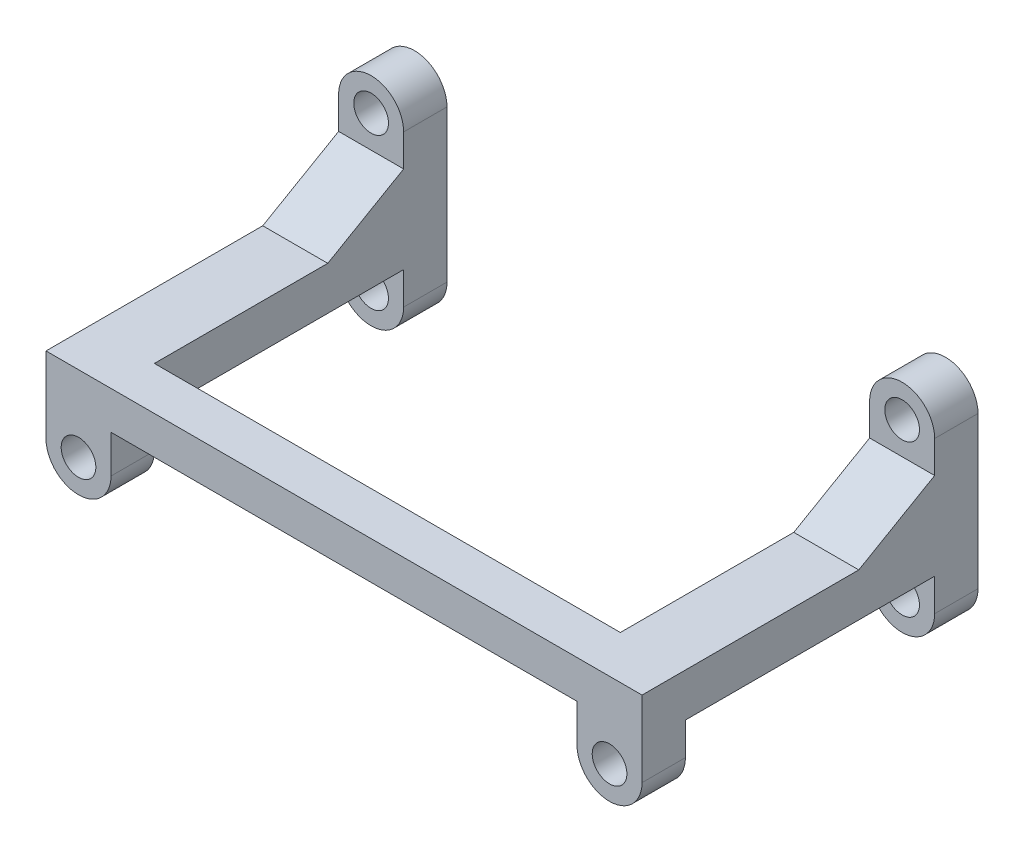
ISO-10303-21;
HEADER;
FILE_DESCRIPTION(('STEP AP214'),'2;1');
FILE_NAME('part.step','',(''),(''),'','','');
FILE_SCHEMA(('AUTOMOTIVE_DESIGN { 1 0 10303 214 1 1 1 1 }'));
ENDSEC;
DATA;
#1=APPLICATION_CONTEXT('core data for automotive mechanical design processes');
#2=APPLICATION_PROTOCOL_DEFINITION('international standard','automotive_design',2000,#1);
#3=PRODUCT_CONTEXT('',#1,'mechanical');
#4=PRODUCT('Part','Part','',(#3));
#5=PRODUCT_RELATED_PRODUCT_CATEGORY('part','',(#4));
#6=PRODUCT_DEFINITION_FORMATION('','',#4);
#7=PRODUCT_DEFINITION_CONTEXT('part definition',#1,'design');
#8=PRODUCT_DEFINITION('design','',#6,#7);
#9=PRODUCT_DEFINITION_SHAPE('','',#8);
#10=(LENGTH_UNIT() NAMED_UNIT(*) SI_UNIT(.MILLI.,.METRE.));
#11=(NAMED_UNIT(*) PLANE_ANGLE_UNIT() SI_UNIT($,.RADIAN.));
#12=(NAMED_UNIT(*) SI_UNIT($,.STERADIAN.) SOLID_ANGLE_UNIT());
#13=UNCERTAINTY_MEASURE_WITH_UNIT(LENGTH_MEASURE(1.E-05),#10,'distance_accuracy_value','');
#14=(GEOMETRIC_REPRESENTATION_CONTEXT(3) GLOBAL_UNCERTAINTY_ASSIGNED_CONTEXT((#13)) GLOBAL_UNIT_ASSIGNED_CONTEXT((#10,
#11,#12)) REPRESENTATION_CONTEXT('',''));
#15=CARTESIAN_POINT('',(0.,0.,0.));
#16=DIRECTION('',(0.,0.,1.));
#17=DIRECTION('',(1.,0.,0.));
#18=AXIS2_PLACEMENT_3D('',#15,#16,#17);
#19=CARTESIAN_POINT('',(1.58290376865477,180.201451884327,-20.));
#20=DIRECTION('',(0.,0.866025403784436,0.500000000000004));
#21=DIRECTION('',(0.,-0.500000000000004,0.866025403784437));
#22=AXIS2_PLACEMENT_3D('',#19,#20,#21);
#23=PLANE('',#22);
#24=DIRECTION('',(0.,0.500000000000004,-0.866025403784437));
#25=VECTOR('',#24,1.);
#26=CARTESIAN_POINT('',(-6.50000000000008,167.499312949454,2.00074999999993));
#27=LINE('',#26,#25);
#28=CARTESIAN_POINT('',(-6.50000000000001,176.16,-13.));
#29=VERTEX_POINT('',#28);
#30=CARTESIAN_POINT('',(-6.49999999999999,180.201451884327,-20.));
#31=VERTEX_POINT('',#30);
#32=EDGE_CURVE('E202',#29,#31,#27,.T.);
#33=ORIENTED_EDGE('',*,*,#32,.T.);
#34=DIRECTION('',(-1.,0.,0.));
#35=VECTOR('',#34,1.);
#36=CARTESIAN_POINT('',(1.58290376865477,180.201451884327,-20.));
#37=LINE('',#36,#35);
#38=CARTESIAN_POINT('',(-12.5,180.201451884327,-20.));
#39=VERTEX_POINT('',#38);
#40=EDGE_CURVE('E221',#31,#39,#37,.T.);
#41=ORIENTED_EDGE('',*,*,#40,.T.);
#42=DIRECTION('',(0.,0.500000000000004,-0.866025403784437));
#43=VECTOR('',#42,1.);
#44=CARTESIAN_POINT('',(-12.5,180.201451884327,-20.));
#45=LINE('',#44,#43);
#46=CARTESIAN_POINT('',(-12.5,176.16,-13.));
#47=VERTEX_POINT('',#46);
#48=EDGE_CURVE('E219',#47,#39,#45,.T.);
#49=ORIENTED_EDGE('',*,*,#48,.F.);
#50=DIRECTION('',(-1.,0.,0.));
#51=VECTOR('',#50,1.);
#52=CARTESIAN_POINT('',(1.58290376865477,176.16,-13.));
#53=LINE('',#52,#51);
#54=EDGE_CURVE('E217',#29,#47,#53,.T.);
#55=ORIENTED_EDGE('',*,*,#54,.F.);
#56=EDGE_LOOP('',(#33,#41,#49,#55));
#57=FACE_BOUND('',#56,.T.);
#58=ADVANCED_FACE('F41',(#57),#23,.T.);
#59=CARTESIAN_POINT('',(-6.50000000000001,176.16,0.));
#60=DIRECTION('',(0.,1.,0.));
#61=DIRECTION('',(0.,0.,1.));
#62=AXIS2_PLACEMENT_3D('',#59,#60,#61);
#63=PLANE('',#62);
#64=DIRECTION('',(0.,0.,1.));
#65=VECTOR('',#64,1.);
#66=CARTESIAN_POINT('',(42.5,176.16,0.));
#67=LINE('',#66,#65);
#68=CARTESIAN_POINT('',(42.5,176.16,-13.));
#69=VERTEX_POINT('',#68);
#70=CARTESIAN_POINT('',(42.5,176.16,7.));
#71=VERTEX_POINT('',#70);
#72=EDGE_CURVE('E56',#69,#71,#67,.T.);
#73=ORIENTED_EDGE('',*,*,#72,.F.);
#74=DIRECTION('',(1.,0.,0.));
#75=VECTOR('',#74,1.);
#76=CARTESIAN_POINT('',(-14.5829037686548,176.16,-13.));
#77=LINE('',#76,#75);
#78=CARTESIAN_POINT('',(36.5,176.16,-13.));
#79=VERTEX_POINT('',#78);
#80=EDGE_CURVE('E449',#79,#69,#77,.T.);
#81=ORIENTED_EDGE('',*,*,#80,.F.);
#82=DIRECTION('',(0.,0.,1.));
#83=VECTOR('',#82,1.);
#84=CARTESIAN_POINT('',(36.5,176.16,0.));
#85=LINE('',#84,#83);
#86=CARTESIAN_POINT('',(36.5,176.16,3.));
#87=VERTEX_POINT('',#86);
#88=EDGE_CURVE('E256',#79,#87,#85,.T.);
#89=ORIENTED_EDGE('',*,*,#88,.T.);
#90=DIRECTION('',(1.,0.,0.));
#91=VECTOR('',#90,1.);
#92=CARTESIAN_POINT('',(-6.50000000000001,176.16,3.));
#93=LINE('',#92,#91);
#94=CARTESIAN_POINT('',(-6.50000000000001,176.16,3.));
#95=VERTEX_POINT('',#94);
#96=EDGE_CURVE('E226',#95,#87,#93,.T.);
#97=ORIENTED_EDGE('',*,*,#96,.F.);
#98=DIRECTION('',(0.,0.,1.));
#99=VECTOR('',#98,1.);
#100=CARTESIAN_POINT('',(-6.50000000000001,176.16,0.));
#101=LINE('',#100,#99);
#102=EDGE_CURVE('E207',#29,#95,#101,.T.);
#103=ORIENTED_EDGE('',*,*,#102,.F.);
#104=ORIENTED_EDGE('',*,*,#54,.T.);
#105=DIRECTION('',(0.,0.,1.));
#106=VECTOR('',#105,1.);
#107=CARTESIAN_POINT('',(-12.5,176.16,0.));
#108=LINE('',#107,#106);
#109=CARTESIAN_POINT('',(-12.5,176.16,7.));
#110=VERTEX_POINT('',#109);
#111=EDGE_CURVE('E237',#47,#110,#108,.T.);
#112=ORIENTED_EDGE('',*,*,#111,.T.);
#113=DIRECTION('',(-1.,0.,0.));
#114=VECTOR('',#113,1.);
#115=CARTESIAN_POINT('',(42.5,176.16,7.));
#116=LINE('',#115,#114);
#117=EDGE_CURVE('E314',#71,#110,#116,.T.);
#118=ORIENTED_EDGE('',*,*,#117,.F.);
#119=EDGE_LOOP('',(#73,#81,#89,#97,#103,#104,#112,#118));
#120=FACE_BOUND('',#119,.T.);
#121=ADVANCED_FACE('F224',(#120),#63,.T.);
#122=CARTESIAN_POINT('',(-6.50000000000001,169.16,0.));
#123=DIRECTION('',(1.,0.,0.));
#124=DIRECTION('',(0.,0.,-1.));
#125=AXIS2_PLACEMENT_3D('',#122,#123,#124);
#126=PLANE('',#125);
#127=DIRECTION('',(0.,1.,0.));
#128=VECTOR('',#127,1.);
#129=CARTESIAN_POINT('',(-6.49999999999998,169.16,-20.));
#130=LINE('',#129,#128);
#131=CARTESIAN_POINT('',(-6.49999999999998,183.16,-20.));
#132=VERTEX_POINT('',#131);
#133=EDGE_CURVE('E210',#31,#132,#130,.T.);
#134=ORIENTED_EDGE('',*,*,#133,.F.);
#135=ORIENTED_EDGE('',*,*,#32,.F.);
#136=ORIENTED_EDGE('',*,*,#102,.T.);
#137=DIRECTION('',(0.,1.,0.));
#138=VECTOR('',#137,1.);
#139=CARTESIAN_POINT('',(-6.50000000000001,172.66,3.));
#140=LINE('',#139,#138);
#141=CARTESIAN_POINT('',(-6.50000000000001,172.66,3.));
#142=VERTEX_POINT('',#141);
#143=EDGE_CURVE('E274',#142,#95,#140,.T.);
#144=ORIENTED_EDGE('',*,*,#143,.F.);
#145=DIRECTION('',(0.,0.,1.));
#146=VECTOR('',#145,1.);
#147=CARTESIAN_POINT('',(-6.50000000000001,172.66,0.));
#148=LINE('',#147,#146);
#149=CARTESIAN_POINT('',(-6.50000000000001,172.66,7.));
#150=VERTEX_POINT('',#149);
#151=EDGE_CURVE('E233',#142,#150,#148,.T.);
#152=ORIENTED_EDGE('',*,*,#151,.T.);
#153=DIRECTION('',(0.,1.,0.));
#154=VECTOR('',#153,1.);
#155=CARTESIAN_POINT('',(-6.50000000000001,169.16,7.));
#156=LINE('',#155,#154);
#157=CARTESIAN_POINT('',(-6.50000000000001,169.16,7.));
#158=VERTEX_POINT('',#157);
#159=EDGE_CURVE('E329',#158,#150,#156,.T.);
#160=ORIENTED_EDGE('',*,*,#159,.F.);
#161=DIRECTION('',(0.,0.,1.));
#162=VECTOR('',#161,1.);
#163=CARTESIAN_POINT('',(-6.50000000000001,169.16,0.));
#164=LINE('',#163,#162);
#165=CARTESIAN_POINT('',(-6.50000000000001,169.16,3.));
#166=VERTEX_POINT('',#165);
#167=EDGE_CURVE('E239',#166,#158,#164,.T.);
#168=ORIENTED_EDGE('',*,*,#167,.F.);
#169=DIRECTION('',(0.,-1.,0.));
#170=VECTOR('',#169,1.);
#171=CARTESIAN_POINT('',(-6.50000000000001,172.16,3.));
#172=LINE('',#171,#170);
#173=CARTESIAN_POINT('',(-6.50000000000001,172.16,3.));
#174=VERTEX_POINT('',#173);
#175=EDGE_CURVE('E357',#174,#166,#172,.T.);
#176=ORIENTED_EDGE('',*,*,#175,.F.);
#177=DIRECTION('',(0.,0.,1.));
#178=VECTOR('',#177,1.);
#179=CARTESIAN_POINT('',(-6.50000000000001,172.16,-24.));
#180=LINE('',#179,#178);
#181=CARTESIAN_POINT('',(-6.50000000000001,172.16,-20.));
#182=VERTEX_POINT('',#181);
#183=EDGE_CURVE('E252',#182,#174,#180,.T.);
#184=ORIENTED_EDGE('',*,*,#183,.F.);
#185=DIRECTION('',(0.,1.,0.));
#186=VECTOR('',#185,1.);
#187=CARTESIAN_POINT('',(-6.50000000000001,0.,-20.));
#188=LINE('',#187,#186);
#189=CARTESIAN_POINT('',(-6.50000000000001,169.16,-20.));
#190=VERTEX_POINT('',#189);
#191=EDGE_CURVE('E292',#190,#182,#188,.T.);
#192=ORIENTED_EDGE('',*,*,#191,.F.);
#193=DIRECTION('',(0.,0.,-1.));
#194=VECTOR('',#193,1.);
#195=CARTESIAN_POINT('',(-6.50000000000001,169.16,-20.));
#196=LINE('',#195,#194);
#197=CARTESIAN_POINT('',(-6.50000000000001,169.16,-24.));
#198=VERTEX_POINT('',#197);
#199=EDGE_CURVE('E228',#190,#198,#196,.T.);
#200=ORIENTED_EDGE('',*,*,#199,.T.);
#201=DIRECTION('',(0.,-1.,0.));
#202=VECTOR('',#201,1.);
#203=CARTESIAN_POINT('',(-6.50000000000001,176.16,-24.));
#204=LINE('',#203,#202);
#205=CARTESIAN_POINT('',(-6.49999999999998,183.16,-24.));
#206=VERTEX_POINT('',#205);
#207=EDGE_CURVE('E243',#206,#198,#204,.T.);
#208=ORIENTED_EDGE('',*,*,#207,.F.);
#209=DIRECTION('',(0.,0.,-1.));
#210=VECTOR('',#209,1.);
#211=CARTESIAN_POINT('',(-6.49999999999998,183.16,-20.));
#212=LINE('',#211,#210);
#213=EDGE_CURVE('E384',#132,#206,#212,.T.);
#214=ORIENTED_EDGE('',*,*,#213,.F.);
#215=EDGE_LOOP('',(#134,#135,#136,#144,#152,#160,#168,#176,#184,#192,#200,#208,#214));
#216=FACE_BOUND('',#215,.T.);
#217=ADVANCED_FACE('F204',(#216),#126,.T.);
#218=CARTESIAN_POINT('',(39.5,169.16,-20.));
#219=DIRECTION('',(0.,0.,-1.));
#220=DIRECTION('',(-1.,0.,0.));
#221=AXIS2_PLACEMENT_3D('',#218,#219,#220);
#222=PLANE('',#221);
#223=CARTESIAN_POINT('',(39.5,183.16,-20.));
#224=DIRECTION('',(0.,0.,-1.));
#225=DIRECTION('',(1.,0.,0.));
#226=AXIS2_PLACEMENT_3D('',#223,#224,#225);
#227=CIRCLE('',#226,1.6);
#228=CARTESIAN_POINT('',(41.1,183.16,-20.));
#229=VERTEX_POINT('',#228);
#230=EDGE_CURVE('E383',#229,#229,#227,.T.);
#231=ORIENTED_EDGE('',*,*,#230,.T.);
#232=EDGE_LOOP('',(#231));
#233=FACE_BOUND('',#232,.T.);
#234=DIRECTION('',(-1.,0.,0.));
#235=VECTOR('',#234,1.);
#236=CARTESIAN_POINT('',(39.5,180.201451884327,-20.));
#237=LINE('',#236,#235);
#238=CARTESIAN_POINT('',(42.5,180.201451884327,-20.));
#239=VERTEX_POINT('',#238);
#240=CARTESIAN_POINT('',(36.5,180.201451884327,-20.));
#241=VERTEX_POINT('',#240);
#242=EDGE_CURVE('E11',#239,#241,#237,.T.);
#243=ORIENTED_EDGE('',*,*,#242,.F.);
#244=DIRECTION('',(0.,-1.,0.));
#245=VECTOR('',#244,1.);
#246=CARTESIAN_POINT('',(42.5,183.16,-20.));
#247=LINE('',#246,#245);
#248=CARTESIAN_POINT('',(42.5,183.16,-20.));
#249=VERTEX_POINT('',#248);
#250=EDGE_CURVE('E399',#249,#239,#247,.T.);
#251=ORIENTED_EDGE('',*,*,#250,.F.);
#252=CARTESIAN_POINT('',(39.5,183.16,-20.));
#253=DIRECTION('',(0.,0.,-1.));
#254=DIRECTION('',(1.,0.,0.));
#255=AXIS2_PLACEMENT_3D('',#252,#253,#254);
#256=CIRCLE('',#255,3.);
#257=CARTESIAN_POINT('',(36.5,183.16,-20.));
#258=VERTEX_POINT('',#257);
#259=EDGE_CURVE('E396',#258,#249,#256,.T.);
#260=ORIENTED_EDGE('',*,*,#259,.F.);
#261=DIRECTION('',(0.,1.,0.));
#262=VECTOR('',#261,1.);
#263=CARTESIAN_POINT('',(36.5,169.16,-20.));
#264=LINE('',#263,#262);
#265=EDGE_CURVE('E394',#241,#258,#264,.T.);
#266=ORIENTED_EDGE('',*,*,#265,.F.);
#267=EDGE_LOOP('',(#243,#251,#260,#266));
#268=FACE_BOUND('',#267,.T.);
#269=ADVANCED_FACE('F632',(#233,#268),#222,.F.);
#270=CARTESIAN_POINT('',(36.5,172.66,0.));
#271=DIRECTION('',(0.,-1.,0.));
#272=DIRECTION('',(0.,0.,-1.));
#273=AXIS2_PLACEMENT_3D('',#270,#271,#272);
#274=PLANE('',#273);
#275=ORIENTED_EDGE('',*,*,#151,.F.);
#276=DIRECTION('',(-1.,0.,0.));
#277=VECTOR('',#276,1.);
#278=CARTESIAN_POINT('',(36.5,172.66,3.));
#279=LINE('',#278,#277);
#280=CARTESIAN_POINT('',(36.5,172.66,3.));
#281=VERTEX_POINT('',#280);
#282=EDGE_CURVE('E362',#281,#142,#279,.T.);
#283=ORIENTED_EDGE('',*,*,#282,.F.);
#284=DIRECTION('',(0.,0.,1.));
#285=VECTOR('',#284,1.);
#286=CARTESIAN_POINT('',(36.5,172.66,0.));
#287=LINE('',#286,#285);
#288=CARTESIAN_POINT('',(36.5,172.66,7.));
#289=VERTEX_POINT('',#288);
#290=EDGE_CURVE('E242',#281,#289,#287,.T.);
#291=ORIENTED_EDGE('',*,*,#290,.T.);
#292=DIRECTION('',(1.,0.,0.));
#293=VECTOR('',#292,1.);
#294=CARTESIAN_POINT('',(-6.50000000000001,172.66,7.));
#295=LINE('',#294,#293);
#296=EDGE_CURVE('E326',#150,#289,#295,.T.);
#297=ORIENTED_EDGE('',*,*,#296,.F.);
#298=EDGE_LOOP('',(#275,#283,#291,#297));
#299=FACE_BOUND('',#298,.T.);
#300=ADVANCED_FACE('F464',(#299),#274,.T.);
#301=CARTESIAN_POINT('',(-9.50000000000002,169.16,4.));
#302=DIRECTION('',(0.,0.,-1.));
#303=DIRECTION('',(-1.,0.,0.));
#304=AXIS2_PLACEMENT_3D('',#301,#302,#303);
#305=CYLINDRICAL_SURFACE('',#304,3.00000000000001);
#306=CARTESIAN_POINT('',(-9.50000000000002,169.16,3.));
#307=DIRECTION('',(0.,0.,-1.));
#308=DIRECTION('',(-1.,0.,0.));
#309=AXIS2_PLACEMENT_3D('',#306,#307,#308);
#310=CIRCLE('',#309,3.00000000000001);
#311=CARTESIAN_POINT('',(-12.5,169.16,3.));
#312=VERTEX_POINT('',#311);
#313=EDGE_CURVE('E359',#166,#312,#310,.T.);
#314=ORIENTED_EDGE('',*,*,#313,.F.);
#315=ORIENTED_EDGE('',*,*,#167,.T.);
#316=CARTESIAN_POINT('',(-9.50000000000002,169.16,7.));
#317=DIRECTION('',(0.,0.,1.));
#318=DIRECTION('',(1.,0.,0.));
#319=AXIS2_PLACEMENT_3D('',#316,#317,#318);
#320=CIRCLE('',#319,3.00000000000001);
#321=CARTESIAN_POINT('',(-12.5,169.16,7.));
#322=VERTEX_POINT('',#321);
#323=EDGE_CURVE('E309',#322,#158,#320,.T.);
#324=ORIENTED_EDGE('',*,*,#323,.F.);
#325=DIRECTION('',(0.,0.,1.));
#326=VECTOR('',#325,1.);
#327=CARTESIAN_POINT('',(-12.5,169.16,0.));
#328=LINE('',#327,#326);
#329=EDGE_CURVE('E250',#312,#322,#328,.T.);
#330=ORIENTED_EDGE('',*,*,#329,.F.);
#331=EDGE_LOOP('',(#314,#315,#324,#330));
#332=FACE_BOUND('',#331,.T.);
#333=ADVANCED_FACE('F518',(#332),#305,.T.);
#334=CARTESIAN_POINT('',(-9.50000000000002,169.16,4.));
#335=DIRECTION('',(0.,0.,-1.));
#336=DIRECTION('',(-1.,0.,0.));
#337=AXIS2_PLACEMENT_3D('',#334,#335,#336);
#338=CYLINDRICAL_SURFACE('',#337,1.59999999999999);
#339=CARTESIAN_POINT('',(-9.50000000000002,169.16,7.));
#340=DIRECTION('',(0.,0.,1.));
#341=DIRECTION('',(1.,0.,0.));
#342=AXIS2_PLACEMENT_3D('',#339,#340,#341);
#343=CIRCLE('',#342,1.59999999999999);
#344=CARTESIAN_POINT('',(-7.90000000000003,169.16,7.));
#345=VERTEX_POINT('',#344);
#346=EDGE_CURVE('E241',#345,#345,#343,.T.);
#347=ORIENTED_EDGE('',*,*,#346,.T.);
#348=EDGE_LOOP('',(#347));
#349=FACE_BOUND('',#348,.T.);
#350=CARTESIAN_POINT('',(-9.50000000000002,169.16,3.));
#351=DIRECTION('',(0.,0.,-1.));
#352=DIRECTION('',(-1.,0.,0.));
#353=AXIS2_PLACEMENT_3D('',#350,#351,#352);
#354=CIRCLE('',#353,1.59999999999999);
#355=CARTESIAN_POINT('',(-11.1,169.16,3.));
#356=VERTEX_POINT('',#355);
#357=EDGE_CURVE('E262',#356,#356,#354,.T.);
#358=ORIENTED_EDGE('',*,*,#357,.T.);
#359=EDGE_LOOP('',(#358));
#360=FACE_BOUND('',#359,.T.);
#361=ADVANCED_FACE('F821',(#349,#360),#338,.F.);
#362=CARTESIAN_POINT('',(39.5,169.16,4.));
#363=DIRECTION('',(0.,0.,-1.));
#364=DIRECTION('',(-1.,0.,0.));
#365=AXIS2_PLACEMENT_3D('',#362,#363,#364);
#366=CYLINDRICAL_SURFACE('',#365,3.);
#367=CARTESIAN_POINT('',(39.5,169.16,3.));
#368=DIRECTION('',(0.,0.,-1.));
#369=DIRECTION('',(-1.,0.,0.));
#370=AXIS2_PLACEMENT_3D('',#367,#368,#369);
#371=CIRCLE('',#370,3.);
#372=CARTESIAN_POINT('',(42.5,169.16,3.));
#373=VERTEX_POINT('',#372);
#374=CARTESIAN_POINT('',(36.5,169.16,3.));
#375=VERTEX_POINT('',#374);
#376=EDGE_CURVE('E347',#373,#375,#371,.T.);
#377=ORIENTED_EDGE('',*,*,#376,.F.);
#378=DIRECTION('',(0.,0.,1.));
#379=VECTOR('',#378,1.);
#380=CARTESIAN_POINT('',(42.5,169.16,0.));
#381=LINE('',#380,#379);
#382=CARTESIAN_POINT('',(42.5,169.16,7.));
#383=VERTEX_POINT('',#382);
#384=EDGE_CURVE('E259',#373,#383,#381,.T.);
#385=ORIENTED_EDGE('',*,*,#384,.T.);
#386=CARTESIAN_POINT('',(39.5,169.16,7.));
#387=DIRECTION('',(0.,0.,1.));
#388=DIRECTION('',(1.,0.,0.));
#389=AXIS2_PLACEMENT_3D('',#386,#387,#388);
#390=CIRCLE('',#389,3.);
#391=CARTESIAN_POINT('',(36.5,169.16,7.));
#392=VERTEX_POINT('',#391);
#393=EDGE_CURVE('E320',#392,#383,#390,.T.);
#394=ORIENTED_EDGE('',*,*,#393,.F.);
#395=DIRECTION('',(0.,0.,1.));
#396=VECTOR('',#395,1.);
#397=CARTESIAN_POINT('',(36.5,169.16,0.));
#398=LINE('',#397,#396);
#399=EDGE_CURVE('E263',#375,#392,#398,.T.);
#400=ORIENTED_EDGE('',*,*,#399,.F.);
#401=EDGE_LOOP('',(#377,#385,#394,#400));
#402=FACE_BOUND('',#401,.T.);
#403=ADVANCED_FACE('F470',(#402),#366,.T.);
#404=CARTESIAN_POINT('',(39.5,169.16,4.));
#405=DIRECTION('',(0.,0.,-1.));
#406=DIRECTION('',(-1.,0.,0.));
#407=AXIS2_PLACEMENT_3D('',#404,#405,#406);
#408=CYLINDRICAL_SURFACE('',#407,1.6);
#409=CARTESIAN_POINT('',(39.5,169.16,7.));
#410=DIRECTION('',(0.,0.,1.));
#411=DIRECTION('',(1.,0.,0.));
#412=AXIS2_PLACEMENT_3D('',#409,#410,#411);
#413=CIRCLE('',#412,1.6);
#414=CARTESIAN_POINT('',(41.1,169.16,7.));
#415=VERTEX_POINT('',#414);
#416=EDGE_CURVE('E261',#415,#415,#413,.T.);
#417=ORIENTED_EDGE('',*,*,#416,.T.);
#418=EDGE_LOOP('',(#417));
#419=FACE_BOUND('',#418,.T.);
#420=CARTESIAN_POINT('',(39.5,169.16,3.));
#421=DIRECTION('',(0.,0.,-1.));
#422=DIRECTION('',(-1.,0.,0.));
#423=AXIS2_PLACEMENT_3D('',#420,#421,#422);
#424=CIRCLE('',#423,1.6);
#425=CARTESIAN_POINT('',(37.9,169.16,3.));
#426=VERTEX_POINT('',#425);
#427=EDGE_CURVE('E254',#426,#426,#424,.T.);
#428=ORIENTED_EDGE('',*,*,#427,.T.);
#429=EDGE_LOOP('',(#428));
#430=FACE_BOUND('',#429,.T.);
#431=ADVANCED_FACE('F797',(#419,#430),#408,.F.);
#432=CARTESIAN_POINT('',(-6.50000000000001,172.16,-24.));
#433=DIRECTION('',(0.,1.,0.));
#434=DIRECTION('',(0.,0.,1.));
#435=AXIS2_PLACEMENT_3D('',#432,#433,#434);
#436=PLANE('',#435);
#437=DIRECTION('',(-1.,0.,0.));
#438=VECTOR('',#437,1.);
#439=CARTESIAN_POINT('',(0.,172.16,-20.));
#440=LINE('',#439,#438);
#441=CARTESIAN_POINT('',(-12.5,172.16,-20.));
#442=VERTEX_POINT('',#441);
#443=EDGE_CURVE('E294',#182,#442,#440,.T.);
#444=ORIENTED_EDGE('',*,*,#443,.F.);
#445=ORIENTED_EDGE('',*,*,#183,.T.);
#446=DIRECTION('',(1.,0.,0.));
#447=VECTOR('',#446,1.);
#448=CARTESIAN_POINT('',(-12.5,172.16,3.));
#449=LINE('',#448,#447);
#450=CARTESIAN_POINT('',(-12.5,172.16,3.));
#451=VERTEX_POINT('',#450);
#452=EDGE_CURVE('E354',#451,#174,#449,.T.);
#453=ORIENTED_EDGE('',*,*,#452,.F.);
#454=DIRECTION('',(0.,0.,1.));
#455=VECTOR('',#454,1.);
#456=CARTESIAN_POINT('',(-12.5,172.16,-24.));
#457=LINE('',#456,#455);
#458=EDGE_CURVE('E248',#442,#451,#457,.T.);
#459=ORIENTED_EDGE('',*,*,#458,.F.);
#460=EDGE_LOOP('',(#444,#445,#453,#459));
#461=FACE_BOUND('',#460,.T.);
#462=ADVANCED_FACE('F428',(#461),#436,.F.);
#463=CARTESIAN_POINT('',(42.5,172.16,-24.));
#464=DIRECTION('',(0.,1.,0.));
#465=DIRECTION('',(0.,0.,1.));
#466=AXIS2_PLACEMENT_3D('',#463,#464,#465);
#467=PLANE('',#466);
#468=DIRECTION('',(-1.,0.,0.));
#469=VECTOR('',#468,1.);
#470=CARTESIAN_POINT('',(0.,172.16,-20.));
#471=LINE('',#470,#469);
#472=CARTESIAN_POINT('',(42.5,172.16,-20.));
#473=VERTEX_POINT('',#472);
#474=CARTESIAN_POINT('',(36.5,172.16,-20.));
#475=VERTEX_POINT('',#474);
#476=EDGE_CURVE('E281',#473,#475,#471,.T.);
#477=ORIENTED_EDGE('',*,*,#476,.F.);
#478=DIRECTION('',(0.,0.,1.));
#479=VECTOR('',#478,1.);
#480=CARTESIAN_POINT('',(42.5,172.16,-24.));
#481=LINE('',#480,#479);
#482=CARTESIAN_POINT('',(42.5,172.16,3.));
#483=VERTEX_POINT('',#482);
#484=EDGE_CURVE('E251',#473,#483,#481,.T.);
#485=ORIENTED_EDGE('',*,*,#484,.T.);
#486=DIRECTION('',(1.,0.,0.));
#487=VECTOR('',#486,1.);
#488=CARTESIAN_POINT('',(36.5,172.16,3.));
#489=LINE('',#488,#487);
#490=CARTESIAN_POINT('',(36.5,172.16,3.));
#491=VERTEX_POINT('',#490);
#492=EDGE_CURVE('E342',#491,#483,#489,.T.);
#493=ORIENTED_EDGE('',*,*,#492,.F.);
#494=DIRECTION('',(0.,0.,1.));
#495=VECTOR('',#494,1.);
#496=CARTESIAN_POINT('',(36.5,172.16,-24.));
#497=LINE('',#496,#495);
#498=EDGE_CURVE('E266',#475,#491,#497,.T.);
#499=ORIENTED_EDGE('',*,*,#498,.F.);
#500=EDGE_LOOP('',(#477,#485,#493,#499));
#501=FACE_BOUND('',#500,.T.);
#502=ADVANCED_FACE('F419',(#501),#467,.F.);
#503=CARTESIAN_POINT('',(-12.5,169.16,0.));
#504=DIRECTION('',(-1.,0.,0.));
#505=DIRECTION('',(0.,0.,1.));
#506=AXIS2_PLACEMENT_3D('',#503,#504,#505);
#507=PLANE('',#506);
#508=ORIENTED_EDGE('',*,*,#111,.F.);
#509=ORIENTED_EDGE('',*,*,#48,.T.);
#510=DIRECTION('',(0.,-1.,0.));
#511=VECTOR('',#510,1.);
#512=CARTESIAN_POINT('',(-12.5,183.16,-20.));
#513=LINE('',#512,#511);
#514=CARTESIAN_POINT('',(-12.5,183.16,-20.));
#515=VERTEX_POINT('',#514);
#516=EDGE_CURVE('E484',#515,#39,#513,.T.);
#517=ORIENTED_EDGE('',*,*,#516,.F.);
#518=DIRECTION('',(0.,0.,-1.));
#519=VECTOR('',#518,1.);
#520=CARTESIAN_POINT('',(-12.5,183.16,-20.));
#521=LINE('',#520,#519);
#522=CARTESIAN_POINT('',(-12.5,183.16,-24.));
#523=VERTEX_POINT('',#522);
#524=EDGE_CURVE('E390',#515,#523,#521,.T.);
#525=ORIENTED_EDGE('',*,*,#524,.T.);
#526=DIRECTION('',(0.,1.,0.));
#527=VECTOR('',#526,1.);
#528=CARTESIAN_POINT('',(-12.5,176.16,-24.));
#529=LINE('',#528,#527);
#530=CARTESIAN_POINT('',(-12.5,169.16,-24.));
#531=VERTEX_POINT('',#530);
#532=EDGE_CURVE('E245',#531,#523,#529,.T.);
#533=ORIENTED_EDGE('',*,*,#532,.F.);
#534=DIRECTION('',(0.,0.,-1.));
#535=VECTOR('',#534,1.);
#536=CARTESIAN_POINT('',(-12.5,169.16,-20.));
#537=LINE('',#536,#535);
#538=CARTESIAN_POINT('',(-12.5,169.16,-20.));
#539=VERTEX_POINT('',#538);
#540=EDGE_CURVE('E289',#539,#531,#537,.T.);
#541=ORIENTED_EDGE('',*,*,#540,.F.);
#542=DIRECTION('',(0.,-1.,0.));
#543=VECTOR('',#542,1.);
#544=CARTESIAN_POINT('',(-12.5,0.,-20.));
#545=LINE('',#544,#543);
#546=EDGE_CURVE('E296',#442,#539,#545,.T.);
#547=ORIENTED_EDGE('',*,*,#546,.F.);
#548=ORIENTED_EDGE('',*,*,#458,.T.);
#549=DIRECTION('',(0.,1.,0.));
#550=VECTOR('',#549,1.);
#551=CARTESIAN_POINT('',(-12.5,169.16,3.));
#552=LINE('',#551,#550);
#553=EDGE_CURVE('E349',#312,#451,#552,.T.);
#554=ORIENTED_EDGE('',*,*,#553,.F.);
#555=ORIENTED_EDGE('',*,*,#329,.T.);
#556=DIRECTION('',(0.,-1.,0.));
#557=VECTOR('',#556,1.);
#558=CARTESIAN_POINT('',(-12.5,176.16,7.));
#559=LINE('',#558,#557);
#560=EDGE_CURVE('E310',#110,#322,#559,.T.);
#561=ORIENTED_EDGE('',*,*,#560,.F.);
#562=EDGE_LOOP('',(#508,#509,#517,#525,#533,#541,#547,#548,#554,#555,#561));
#563=FACE_BOUND('',#562,.T.);
#564=ADVANCED_FACE('F416',(#563),#507,.T.);
#565=CARTESIAN_POINT('',(42.5,176.16,0.));
#566=DIRECTION('',(1.,0.,0.));
#567=DIRECTION('',(0.,1.,0.));
#568=AXIS2_PLACEMENT_3D('',#565,#566,#567);
#569=PLANE('',#568);
#570=DIRECTION('',(0.,0.500000000000004,-0.866025403784437));
#571=VECTOR('',#570,1.);
#572=CARTESIAN_POINT('',(42.5,180.201451884327,-20.));
#573=LINE('',#572,#571);
#574=EDGE_CURVE('E213',#69,#239,#573,.T.);
#575=ORIENTED_EDGE('',*,*,#574,.F.);
#576=ORIENTED_EDGE('',*,*,#72,.T.);
#577=DIRECTION('',(0.,1.,0.));
#578=VECTOR('',#577,1.);
#579=CARTESIAN_POINT('',(42.5,169.16,7.));
#580=LINE('',#579,#578);
#581=EDGE_CURVE('E317',#383,#71,#580,.T.);
#582=ORIENTED_EDGE('',*,*,#581,.F.);
#583=ORIENTED_EDGE('',*,*,#384,.F.);
#584=DIRECTION('',(0.,-1.,0.));
#585=VECTOR('',#584,1.);
#586=CARTESIAN_POINT('',(42.5,172.16,3.));
#587=LINE('',#586,#585);
#588=EDGE_CURVE('E345',#483,#373,#587,.T.);
#589=ORIENTED_EDGE('',*,*,#588,.F.);
#590=ORIENTED_EDGE('',*,*,#484,.F.);
#591=DIRECTION('',(0.,1.,0.));
#592=VECTOR('',#591,1.);
#593=CARTESIAN_POINT('',(42.5,0.,-20.));
#594=LINE('',#593,#592);
#595=CARTESIAN_POINT('',(42.5,169.16,-20.));
#596=VERTEX_POINT('',#595);
#597=EDGE_CURVE('E279',#596,#473,#594,.T.);
#598=ORIENTED_EDGE('',*,*,#597,.F.);
#599=DIRECTION('',(0.,0.,-1.));
#600=VECTOR('',#599,1.);
#601=CARTESIAN_POINT('',(42.5,169.16,-20.));
#602=LINE('',#601,#600);
#603=CARTESIAN_POINT('',(42.5,169.16,-24.));
#604=VERTEX_POINT('',#603);
#605=EDGE_CURVE('E227',#596,#604,#602,.T.);
#606=ORIENTED_EDGE('',*,*,#605,.T.);
#607=DIRECTION('',(0.,-1.,0.));
#608=VECTOR('',#607,1.);
#609=CARTESIAN_POINT('',(42.5,176.16,-24.));
#610=LINE('',#609,#608);
#611=CARTESIAN_POINT('',(42.5,183.16,-24.));
#612=VERTEX_POINT('',#611);
#613=EDGE_CURVE('E273',#612,#604,#610,.T.);
#614=ORIENTED_EDGE('',*,*,#613,.F.);
#615=DIRECTION('',(0.,0.,-1.));
#616=VECTOR('',#615,1.);
#617=CARTESIAN_POINT('',(42.5,183.16,-20.));
#618=LINE('',#617,#616);
#619=EDGE_CURVE('E258',#249,#612,#618,.T.);
#620=ORIENTED_EDGE('',*,*,#619,.F.);
#621=ORIENTED_EDGE('',*,*,#250,.T.);
#622=EDGE_LOOP('',(#575,#576,#582,#583,#589,#590,#598,#606,#614,#620,#621));
#623=FACE_BOUND('',#622,.T.);
#624=ADVANCED_FACE('F418',(#623),#569,.T.);
#625=CARTESIAN_POINT('',(36.5,169.16,0.));
#626=DIRECTION('',(-1.,0.,0.));
#627=DIRECTION('',(0.,-1.,0.));
#628=AXIS2_PLACEMENT_3D('',#625,#626,#627);
#629=PLANE('',#628);
#630=ORIENTED_EDGE('',*,*,#88,.F.);
#631=DIRECTION('',(0.,-0.500000000000004,0.866025403784437));
#632=VECTOR('',#631,1.);
#633=CARTESIAN_POINT('',(36.5,168.509675920536,0.250749999999906));
#634=LINE('',#633,#632);
#635=EDGE_CURVE('E214',#241,#79,#634,.T.);
#636=ORIENTED_EDGE('',*,*,#635,.F.);
#637=ORIENTED_EDGE('',*,*,#265,.T.);
#638=DIRECTION('',(0.,0.,-1.));
#639=VECTOR('',#638,1.);
#640=CARTESIAN_POINT('',(36.5,183.16,-20.));
#641=LINE('',#640,#639);
#642=CARTESIAN_POINT('',(36.5,183.16,-24.));
#643=VERTEX_POINT('',#642);
#644=EDGE_CURVE('E401',#258,#643,#641,.T.);
#645=ORIENTED_EDGE('',*,*,#644,.T.);
#646=DIRECTION('',(0.,1.,0.));
#647=VECTOR('',#646,1.);
#648=CARTESIAN_POINT('',(36.5,176.16,-24.));
#649=LINE('',#648,#647);
#650=CARTESIAN_POINT('',(36.5,169.16,-24.));
#651=VERTEX_POINT('',#650);
#652=EDGE_CURVE('E247',#651,#643,#649,.T.);
#653=ORIENTED_EDGE('',*,*,#652,.F.);
#654=DIRECTION('',(0.,0.,-1.));
#655=VECTOR('',#654,1.);
#656=CARTESIAN_POINT('',(36.5,169.16,-20.));
#657=LINE('',#656,#655);
#658=CARTESIAN_POINT('',(36.5,169.16,-20.));
#659=VERTEX_POINT('',#658);
#660=EDGE_CURVE('E276',#659,#651,#657,.T.);
#661=ORIENTED_EDGE('',*,*,#660,.F.);
#662=DIRECTION('',(0.,-1.,0.));
#663=VECTOR('',#662,1.);
#664=CARTESIAN_POINT('',(36.5,0.,-20.));
#665=LINE('',#664,#663);
#666=EDGE_CURVE('E283',#475,#659,#665,.T.);
#667=ORIENTED_EDGE('',*,*,#666,.F.);
#668=ORIENTED_EDGE('',*,*,#498,.T.);
#669=DIRECTION('',(0.,1.,0.));
#670=VECTOR('',#669,1.);
#671=CARTESIAN_POINT('',(36.5,169.16,3.));
#672=LINE('',#671,#670);
#673=EDGE_CURVE('E313',#375,#491,#672,.T.);
#674=ORIENTED_EDGE('',*,*,#673,.F.);
#675=ORIENTED_EDGE('',*,*,#399,.T.);
#676=DIRECTION('',(0.,-1.,0.));
#677=VECTOR('',#676,1.);
#678=CARTESIAN_POINT('',(36.5,172.66,7.));
#679=LINE('',#678,#677);
#680=EDGE_CURVE('E323',#289,#392,#679,.T.);
#681=ORIENTED_EDGE('',*,*,#680,.F.);
#682=ORIENTED_EDGE('',*,*,#290,.F.);
#683=DIRECTION('',(0.,-1.,0.));
#684=VECTOR('',#683,1.);
#685=CARTESIAN_POINT('',(36.5,176.16,3.));
#686=LINE('',#685,#684);
#687=EDGE_CURVE('E364',#87,#281,#686,.T.);
#688=ORIENTED_EDGE('',*,*,#687,.F.);
#689=EDGE_LOOP('',(#630,#636,#637,#645,#653,#661,#667,#668,#674,#675,#681,#682,#688));
#690=FACE_BOUND('',#689,.T.);
#691=ADVANCED_FACE('F425',(#690),#629,.T.);
#692=CARTESIAN_POINT('',(39.5,169.16,-20.));
#693=DIRECTION('',(0.,0.,-1.));
#694=DIRECTION('',(-1.,0.,0.));
#695=AXIS2_PLACEMENT_3D('',#692,#693,#694);
#696=CYLINDRICAL_SURFACE('',#695,3.);
#697=CARTESIAN_POINT('',(39.5,169.16,-24.));
#698=DIRECTION('',(0.,0.,-1.));
#699=DIRECTION('',(-1.,0.,0.));
#700=AXIS2_PLACEMENT_3D('',#697,#698,#699);
#701=CIRCLE('',#700,3.);
#702=EDGE_CURVE('E272',#604,#651,#701,.T.);
#703=ORIENTED_EDGE('',*,*,#702,.F.);
#704=ORIENTED_EDGE('',*,*,#605,.F.);
#705=CARTESIAN_POINT('',(39.5,169.16,-20.));
#706=DIRECTION('',(0.,0.,-1.));
#707=DIRECTION('',(-1.,0.,0.));
#708=AXIS2_PLACEMENT_3D('',#705,#706,#707);
#709=CIRCLE('',#708,3.);
#710=EDGE_CURVE('E265',#596,#659,#709,.T.);
#711=ORIENTED_EDGE('',*,*,#710,.T.);
#712=ORIENTED_EDGE('',*,*,#660,.T.);
#713=EDGE_LOOP('',(#703,#704,#711,#712));
#714=FACE_BOUND('',#713,.T.);
#715=ADVANCED_FACE('F649',(#714),#696,.T.);
#716=CARTESIAN_POINT('',(0.,0.,-20.));
#717=DIRECTION('',(0.,0.,-1.));
#718=DIRECTION('',(-1.,0.,0.));
#719=AXIS2_PLACEMENT_3D('',#716,#717,#718);
#720=PLANE('',#719);
#721=CARTESIAN_POINT('',(39.5,169.16,-20.));
#722=DIRECTION('',(0.,0.,-1.));
#723=DIRECTION('',(-1.,0.,0.));
#724=AXIS2_PLACEMENT_3D('',#721,#722,#723);
#725=CIRCLE('',#724,1.6);
#726=CARTESIAN_POINT('',(37.9,169.16,-20.));
#727=VERTEX_POINT('',#726);
#728=EDGE_CURVE('E306',#727,#727,#725,.F.);
#729=ORIENTED_EDGE('',*,*,#728,.F.);
#730=EDGE_LOOP('',(#729));
#731=FACE_BOUND('',#730,.T.);
#732=ORIENTED_EDGE('',*,*,#597,.T.);
#733=ORIENTED_EDGE('',*,*,#476,.T.);
#734=ORIENTED_EDGE('',*,*,#666,.T.);
#735=ORIENTED_EDGE('',*,*,#710,.F.);
#736=EDGE_LOOP('',(#732,#733,#734,#735));
#737=FACE_BOUND('',#736,.T.);
#738=ADVANCED_FACE('F531',(#731,#737),#720,.F.);
#739=CARTESIAN_POINT('',(-9.50000000000002,169.16,-20.));
#740=DIRECTION('',(0.,0.,-1.));
#741=DIRECTION('',(-1.,0.,0.));
#742=AXIS2_PLACEMENT_3D('',#739,#740,#741);
#743=CYLINDRICAL_SURFACE('',#742,3.00000000000001);
#744=CARTESIAN_POINT('',(-9.50000000000002,169.16,-24.));
#745=DIRECTION('',(0.,0.,-1.));
#746=DIRECTION('',(-1.,0.,0.));
#747=AXIS2_PLACEMENT_3D('',#744,#745,#746);
#748=CIRCLE('',#747,3.00000000000001);
#749=EDGE_CURVE('E49',#198,#531,#748,.T.);
#750=ORIENTED_EDGE('',*,*,#749,.F.);
#751=ORIENTED_EDGE('',*,*,#199,.F.);
#752=CARTESIAN_POINT('',(-9.50000000000002,169.16,-20.));
#753=DIRECTION('',(0.,0.,-1.));
#754=DIRECTION('',(-1.,0.,0.));
#755=AXIS2_PLACEMENT_3D('',#752,#753,#754);
#756=CIRCLE('',#755,3.00000000000001);
#757=EDGE_CURVE('E285',#190,#539,#756,.T.);
#758=ORIENTED_EDGE('',*,*,#757,.T.);
#759=ORIENTED_EDGE('',*,*,#540,.T.);
#760=EDGE_LOOP('',(#750,#751,#758,#759));
#761=FACE_BOUND('',#760,.T.);
#762=ADVANCED_FACE('F503',(#761),#743,.T.);
#763=CARTESIAN_POINT('',(0.,0.,-20.));
#764=DIRECTION('',(0.,0.,-1.));
#765=DIRECTION('',(-1.,0.,0.));
#766=AXIS2_PLACEMENT_3D('',#763,#764,#765);
#767=PLANE('',#766);
#768=CARTESIAN_POINT('',(-9.50000000000002,169.16,-20.));
#769=DIRECTION('',(0.,0.,-1.));
#770=DIRECTION('',(-1.,0.,0.));
#771=AXIS2_PLACEMENT_3D('',#768,#769,#770);
#772=CIRCLE('',#771,1.60000000000001);
#773=CARTESIAN_POINT('',(-11.1,169.16,-20.));
#774=VERTEX_POINT('',#773);
#775=EDGE_CURVE('E302',#774,#774,#772,.F.);
#776=ORIENTED_EDGE('',*,*,#775,.F.);
#777=EDGE_LOOP('',(#776));
#778=FACE_BOUND('',#777,.T.);
#779=ORIENTED_EDGE('',*,*,#191,.T.);
#780=ORIENTED_EDGE('',*,*,#443,.T.);
#781=ORIENTED_EDGE('',*,*,#546,.T.);
#782=ORIENTED_EDGE('',*,*,#757,.F.);
#783=EDGE_LOOP('',(#779,#780,#781,#782));
#784=FACE_BOUND('',#783,.T.);
#785=ADVANCED_FACE('F520',(#778,#784),#767,.F.);
#786=CARTESIAN_POINT('',(-9.50000000000002,169.16,44.001));
#787=DIRECTION('',(0.,0.,-1.));
#788=DIRECTION('',(-1.,0.,0.));
#789=AXIS2_PLACEMENT_3D('',#786,#787,#788);
#790=CYLINDRICAL_SURFACE('',#789,1.60000000000001);
#791=CARTESIAN_POINT('',(-9.50000000000002,169.16,-24.));
#792=DIRECTION('',(0.,0.,1.));
#793=DIRECTION('',(1.,0.,0.));
#794=AXIS2_PLACEMENT_3D('',#791,#792,#793);
#795=CIRCLE('',#794,1.60000000000001);
#796=CARTESIAN_POINT('',(-7.90000000000002,169.16,-24.));
#797=VERTEX_POINT('',#796);
#798=EDGE_CURVE('E298',#797,#797,#795,.F.);
#799=ORIENTED_EDGE('',*,*,#798,.T.);
#800=EDGE_LOOP('',(#799));
#801=FACE_BOUND('',#800,.T.);
#802=ORIENTED_EDGE('',*,*,#775,.T.);
#803=EDGE_LOOP('',(#802));
#804=FACE_BOUND('',#803,.T.);
#805=ADVANCED_FACE('F522',(#801,#804),#790,.F.);
#806=CARTESIAN_POINT('',(39.5,169.16,44.001));
#807=DIRECTION('',(0.,0.,-1.));
#808=DIRECTION('',(-1.,0.,0.));
#809=AXIS2_PLACEMENT_3D('',#806,#807,#808);
#810=CYLINDRICAL_SURFACE('',#809,1.6);
#811=CARTESIAN_POINT('',(39.5,169.16,-24.));
#812=DIRECTION('',(0.,0.,1.));
#813=DIRECTION('',(1.,0.,0.));
#814=AXIS2_PLACEMENT_3D('',#811,#812,#813);
#815=CIRCLE('',#814,1.6);
#816=CARTESIAN_POINT('',(41.1,169.16,-24.));
#817=VERTEX_POINT('',#816);
#818=EDGE_CURVE('E305',#817,#817,#815,.F.);
#819=ORIENTED_EDGE('',*,*,#818,.T.);
#820=EDGE_LOOP('',(#819));
#821=FACE_BOUND('',#820,.T.);
#822=ORIENTED_EDGE('',*,*,#728,.T.);
#823=EDGE_LOOP('',(#822));
#824=FACE_BOUND('',#823,.T.);
#825=ADVANCED_FACE('F371',(#821,#824),#810,.F.);
#826=CARTESIAN_POINT('',(-9.50000000000002,169.16,7.));
#827=DIRECTION('',(0.,0.,1.));
#828=DIRECTION('',(1.,0.,0.));
#829=AXIS2_PLACEMENT_3D('',#826,#827,#828);
#830=PLANE('',#829);
#831=ORIENTED_EDGE('',*,*,#416,.F.);
#832=EDGE_LOOP('',(#831));
#833=FACE_BOUND('',#832,.T.);
#834=ORIENTED_EDGE('',*,*,#323,.T.);
#835=ORIENTED_EDGE('',*,*,#159,.T.);
#836=ORIENTED_EDGE('',*,*,#296,.T.);
#837=ORIENTED_EDGE('',*,*,#680,.T.);
#838=ORIENTED_EDGE('',*,*,#393,.T.);
#839=ORIENTED_EDGE('',*,*,#581,.T.);
#840=ORIENTED_EDGE('',*,*,#117,.T.);
#841=ORIENTED_EDGE('',*,*,#560,.T.);
#842=EDGE_LOOP('',(#834,#835,#836,#837,#838,#839,#840,#841));
#843=FACE_BOUND('',#842,.T.);
#844=ORIENTED_EDGE('',*,*,#346,.F.);
#845=EDGE_LOOP('',(#844));
#846=FACE_BOUND('',#845,.T.);
#847=ADVANCED_FACE('F412',(#833,#843,#846),#830,.T.);
#848=CARTESIAN_POINT('',(39.5,169.16,3.));
#849=DIRECTION('',(0.,0.,-1.));
#850=DIRECTION('',(-1.,0.,0.));
#851=AXIS2_PLACEMENT_3D('',#848,#849,#850);
#852=PLANE('',#851);
#853=ORIENTED_EDGE('',*,*,#427,.F.);
#854=EDGE_LOOP('',(#853));
#855=FACE_BOUND('',#854,.T.);
#856=ORIENTED_EDGE('',*,*,#673,.T.);
#857=ORIENTED_EDGE('',*,*,#492,.T.);
#858=ORIENTED_EDGE('',*,*,#588,.T.);
#859=ORIENTED_EDGE('',*,*,#376,.T.);
#860=EDGE_LOOP('',(#856,#857,#858,#859));
#861=FACE_BOUND('',#860,.T.);
#862=ADVANCED_FACE('F540',(#855,#861),#852,.T.);
#863=CARTESIAN_POINT('',(-9.50000000000002,169.16,3.));
#864=DIRECTION('',(0.,0.,-1.));
#865=DIRECTION('',(-1.,0.,0.));
#866=AXIS2_PLACEMENT_3D('',#863,#864,#865);
#867=PLANE('',#866);
#868=ORIENTED_EDGE('',*,*,#357,.F.);
#869=EDGE_LOOP('',(#868));
#870=FACE_BOUND('',#869,.T.);
#871=ORIENTED_EDGE('',*,*,#553,.T.);
#872=ORIENTED_EDGE('',*,*,#452,.T.);
#873=ORIENTED_EDGE('',*,*,#175,.T.);
#874=ORIENTED_EDGE('',*,*,#313,.T.);
#875=EDGE_LOOP('',(#871,#872,#873,#874));
#876=FACE_BOUND('',#875,.T.);
#877=ADVANCED_FACE('F515',(#870,#876),#867,.T.);
#878=CARTESIAN_POINT('',(0.,0.,3.));
#879=DIRECTION('',(0.,0.,-1.));
#880=DIRECTION('',(-1.,0.,0.));
#881=AXIS2_PLACEMENT_3D('',#878,#879,#880);
#882=PLANE('',#881);
#883=ORIENTED_EDGE('',*,*,#96,.T.);
#884=ORIENTED_EDGE('',*,*,#687,.T.);
#885=ORIENTED_EDGE('',*,*,#282,.T.);
#886=ORIENTED_EDGE('',*,*,#143,.T.);
#887=EDGE_LOOP('',(#883,#884,#885,#886));
#888=FACE_BOUND('',#887,.T.);
#889=ADVANCED_FACE('F377',(#888),#882,.T.);
#890=CARTESIAN_POINT('',(-60.,-159.299205854416,-24.));
#891=DIRECTION('',(0.,0.,1.));
#892=DIRECTION('',(1.,0.,0.));
#893=AXIS2_PLACEMENT_3D('',#890,#891,#892);
#894=PLANE('',#893);
#895=ORIENTED_EDGE('',*,*,#652,.T.);
#896=CARTESIAN_POINT('',(39.5,183.16,-24.));
#897=DIRECTION('',(0.,0.,-1.));
#898=DIRECTION('',(1.,0.,0.));
#899=AXIS2_PLACEMENT_3D('',#896,#897,#898);
#900=CIRCLE('',#899,3.);
#901=EDGE_CURVE('E387',#643,#612,#900,.T.);
#902=ORIENTED_EDGE('',*,*,#901,.T.);
#903=ORIENTED_EDGE('',*,*,#613,.T.);
#904=ORIENTED_EDGE('',*,*,#702,.T.);
#905=EDGE_LOOP('',(#895,#902,#903,#904));
#906=FACE_BOUND('',#905,.T.);
#907=ORIENTED_EDGE('',*,*,#818,.F.);
#908=EDGE_LOOP('',(#907));
#909=FACE_BOUND('',#908,.T.);
#910=CARTESIAN_POINT('',(39.5,183.16,-24.));
#911=DIRECTION('',(0.,0.,-1.));
#912=DIRECTION('',(1.,0.,0.));
#913=AXIS2_PLACEMENT_3D('',#910,#911,#912);
#914=CIRCLE('',#913,1.6);
#915=CARTESIAN_POINT('',(41.1,183.16,-24.));
#916=VERTEX_POINT('',#915);
#917=EDGE_CURVE('E381',#916,#916,#914,.T.);
#918=ORIENTED_EDGE('',*,*,#917,.F.);
#919=EDGE_LOOP('',(#918));
#920=FACE_BOUND('',#919,.T.);
#921=ADVANCED_FACE('F43',(#906,#909,#920),#894,.F.);
#922=ORIENTED_EDGE('',*,*,#532,.T.);
#923=CARTESIAN_POINT('',(-9.49999999999999,183.16,-24.));
#924=DIRECTION('',(0.,0.,1.));
#925=DIRECTION('',(-1.,0.,0.));
#926=AXIS2_PLACEMENT_3D('',#923,#924,#925);
#927=CIRCLE('',#926,3.);
#928=EDGE_CURVE('E481',#206,#523,#927,.T.);
#929=ORIENTED_EDGE('',*,*,#928,.F.);
#930=ORIENTED_EDGE('',*,*,#207,.T.);
#931=ORIENTED_EDGE('',*,*,#749,.T.);
#932=EDGE_LOOP('',(#922,#929,#930,#931));
#933=FACE_BOUND('',#932,.T.);
#934=ORIENTED_EDGE('',*,*,#798,.F.);
#935=EDGE_LOOP('',(#934));
#936=FACE_BOUND('',#935,.T.);
#937=CARTESIAN_POINT('',(-9.49999999999999,183.16,-24.));
#938=DIRECTION('',(0.,0.,1.));
#939=DIRECTION('',(-1.,0.,0.));
#940=AXIS2_PLACEMENT_3D('',#937,#938,#939);
#941=CIRCLE('',#940,1.6);
#942=CARTESIAN_POINT('',(-11.1,183.16,-24.));
#943=VERTEX_POINT('',#942);
#944=EDGE_CURVE('E476',#943,#943,#941,.T.);
#945=ORIENTED_EDGE('',*,*,#944,.T.);
#946=EDGE_LOOP('',(#945));
#947=FACE_BOUND('',#946,.T.);
#948=ADVANCED_FACE('F376',(#933,#936,#947),#894,.F.);
#949=CARTESIAN_POINT('',(39.5,183.16,-20.));
#950=DIRECTION('',(0.,0.,-1.));
#951=DIRECTION('',(-1.,0.,0.));
#952=AXIS2_PLACEMENT_3D('',#949,#950,#951);
#953=CYLINDRICAL_SURFACE('',#952,3.);
#954=ORIENTED_EDGE('',*,*,#901,.F.);
#955=ORIENTED_EDGE('',*,*,#644,.F.);
#956=ORIENTED_EDGE('',*,*,#259,.T.);
#957=ORIENTED_EDGE('',*,*,#619,.T.);
#958=EDGE_LOOP('',(#954,#955,#956,#957));
#959=FACE_BOUND('',#958,.T.);
#960=ADVANCED_FACE('F563',(#959),#953,.T.);
#961=CARTESIAN_POINT('',(39.5,183.16,-20.));
#962=DIRECTION('',(0.,0.,-1.));
#963=DIRECTION('',(-1.,0.,0.));
#964=AXIS2_PLACEMENT_3D('',#961,#962,#963);
#965=CYLINDRICAL_SURFACE('',#964,1.6);
#966=ORIENTED_EDGE('',*,*,#230,.F.);
#967=EDGE_LOOP('',(#966));
#968=FACE_BOUND('',#967,.T.);
#969=ORIENTED_EDGE('',*,*,#917,.T.);
#970=EDGE_LOOP('',(#969));
#971=FACE_BOUND('',#970,.T.);
#972=ADVANCED_FACE('F570',(#968,#971),#965,.F.);
#973=CARTESIAN_POINT('',(-9.49999999999999,169.16,-20.));
#974=DIRECTION('',(0.,0.,-1.));
#975=DIRECTION('',(1.,0.,0.));
#976=AXIS2_PLACEMENT_3D('',#973,#974,#975);
#977=PLANE('',#976);
#978=ORIENTED_EDGE('',*,*,#516,.T.);
#979=ORIENTED_EDGE('',*,*,#40,.F.);
#980=ORIENTED_EDGE('',*,*,#133,.T.);
#981=CARTESIAN_POINT('',(-9.49999999999999,183.16,-20.));
#982=DIRECTION('',(0.,0.,1.));
#983=DIRECTION('',(-1.,0.,0.));
#984=AXIS2_PLACEMENT_3D('',#981,#982,#983);
#985=CIRCLE('',#984,3.);
#986=EDGE_CURVE('E487',#132,#515,#985,.T.);
#987=ORIENTED_EDGE('',*,*,#986,.T.);
#988=EDGE_LOOP('',(#978,#979,#980,#987));
#989=FACE_BOUND('',#988,.T.);
#990=CARTESIAN_POINT('',(-9.49999999999999,183.16,-20.));
#991=DIRECTION('',(0.,0.,1.));
#992=DIRECTION('',(-1.,0.,0.));
#993=AXIS2_PLACEMENT_3D('',#990,#991,#992);
#994=CIRCLE('',#993,1.6);
#995=CARTESIAN_POINT('',(-11.1,183.16,-20.));
#996=VERTEX_POINT('',#995);
#997=EDGE_CURVE('E478',#996,#996,#994,.T.);
#998=ORIENTED_EDGE('',*,*,#997,.F.);
#999=EDGE_LOOP('',(#998));
#1000=FACE_BOUND('',#999,.T.);
#1001=ADVANCED_FACE('F577',(#989,#1000),#977,.F.);
#1002=CARTESIAN_POINT('',(-9.49999999999999,183.16,-20.));
#1003=DIRECTION('',(0.,0.,-1.));
#1004=DIRECTION('',(-1.,0.,0.));
#1005=AXIS2_PLACEMENT_3D('',#1002,#1003,#1004);
#1006=CYLINDRICAL_SURFACE('',#1005,3.);
#1007=ORIENTED_EDGE('',*,*,#928,.T.);
#1008=ORIENTED_EDGE('',*,*,#524,.F.);
#1009=ORIENTED_EDGE('',*,*,#986,.F.);
#1010=ORIENTED_EDGE('',*,*,#213,.T.);
#1011=EDGE_LOOP('',(#1007,#1008,#1009,#1010));
#1012=FACE_BOUND('',#1011,.T.);
#1013=ADVANCED_FACE('F446',(#1012),#1006,.T.);
#1014=CARTESIAN_POINT('',(-9.49999999999999,183.16,-20.));
#1015=DIRECTION('',(0.,0.,-1.));
#1016=DIRECTION('',(-1.,0.,0.));
#1017=AXIS2_PLACEMENT_3D('',#1014,#1015,#1016);
#1018=CYLINDRICAL_SURFACE('',#1017,1.6);
#1019=ORIENTED_EDGE('',*,*,#997,.T.);
#1020=EDGE_LOOP('',(#1019));
#1021=FACE_BOUND('',#1020,.T.);
#1022=ORIENTED_EDGE('',*,*,#944,.F.);
#1023=EDGE_LOOP('',(#1022));
#1024=FACE_BOUND('',#1023,.T.);
#1025=ADVANCED_FACE('F441',(#1021,#1024),#1018,.F.);
#1026=ORIENTED_EDGE('',*,*,#635,.T.);
#1027=ORIENTED_EDGE('',*,*,#80,.T.);
#1028=ORIENTED_EDGE('',*,*,#574,.T.);
#1029=ORIENTED_EDGE('',*,*,#242,.T.);
#1030=EDGE_LOOP('',(#1026,#1027,#1028,#1029));
#1031=FACE_BOUND('',#1030,.T.);
#1032=ADVANCED_FACE('F435',(#1031),#23,.T.);
#1033=CLOSED_SHELL('',(#58,#121,#217,#269,#300,#333,#361,#403,#431,#462,#502,#564,#624,#691,
#715,#738,#762,#785,#805,#825,#847,#862,#877,#889,#921,#948,#960,#972,#1001,#1013,#1025,#1032));
#1034=MANIFOLD_SOLID_BREP('B2',#1033);
#1035=ADVANCED_BREP_SHAPE_REPRESENTATION('',(#18,#1034),#14);
#1036=SHAPE_DEFINITION_REPRESENTATION(#9,#1035);
ENDSEC;
END-ISO-10303-21;
